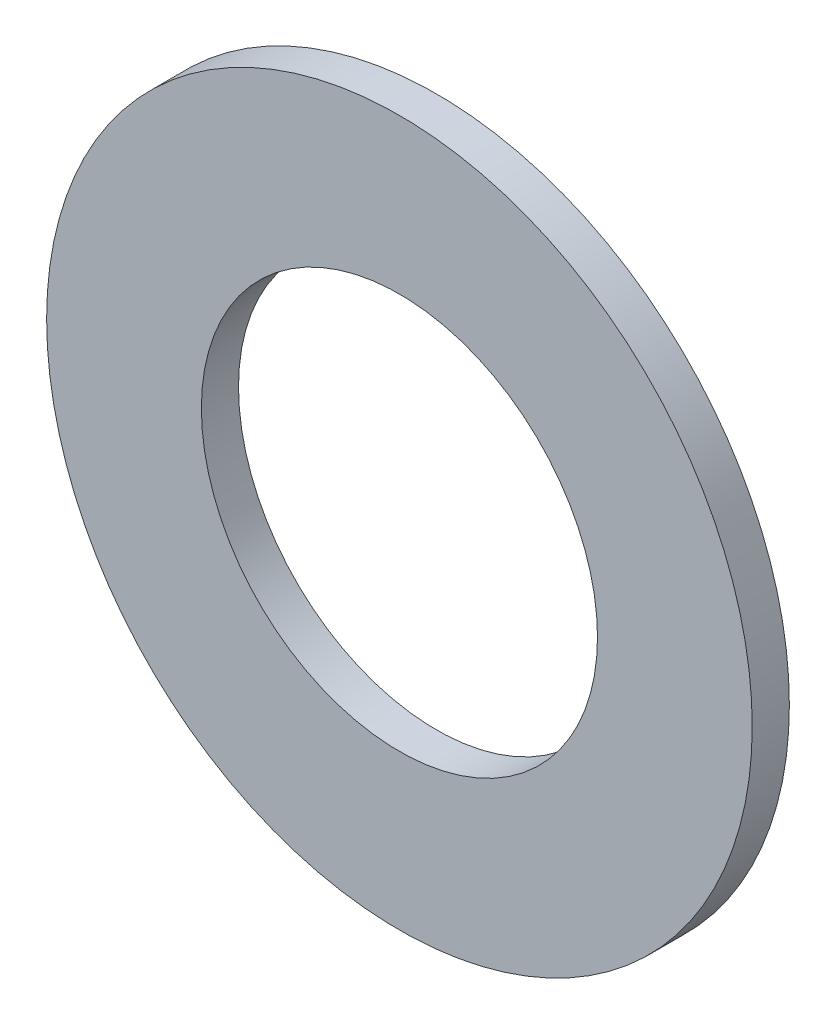
ISO-10303-21;
HEADER;
FILE_DESCRIPTION(('STEP AP214'),'2;1');
FILE_NAME('part.step','',(''),(''),'','','');
FILE_SCHEMA(('AUTOMOTIVE_DESIGN { 1 0 10303 214 1 1 1 1 }'));
ENDSEC;
DATA;
#1=APPLICATION_CONTEXT('core data for automotive mechanical design processes');
#2=APPLICATION_PROTOCOL_DEFINITION('international standard','automotive_design',2000,#1);
#3=PRODUCT_CONTEXT('',#1,'mechanical');
#4=PRODUCT('Part','Part','',(#3));
#5=PRODUCT_RELATED_PRODUCT_CATEGORY('part','',(#4));
#6=PRODUCT_DEFINITION_FORMATION('','',#4);
#7=PRODUCT_DEFINITION_CONTEXT('part definition',#1,'design');
#8=PRODUCT_DEFINITION('design','',#6,#7);
#9=PRODUCT_DEFINITION_SHAPE('','',#8);
#10=(LENGTH_UNIT() NAMED_UNIT(*) SI_UNIT(.MILLI.,.METRE.));
#11=(NAMED_UNIT(*) PLANE_ANGLE_UNIT() SI_UNIT($,.RADIAN.));
#12=(NAMED_UNIT(*) SI_UNIT($,.STERADIAN.) SOLID_ANGLE_UNIT());
#13=UNCERTAINTY_MEASURE_WITH_UNIT(LENGTH_MEASURE(1.E-05),#10,'distance_accuracy_value','');
#14=(GEOMETRIC_REPRESENTATION_CONTEXT(3) GLOBAL_UNCERTAINTY_ASSIGNED_CONTEXT((#13)) GLOBAL_UNIT_ASSIGNED_CONTEXT((#10,
#11,#12)) REPRESENTATION_CONTEXT('',''));
#15=CARTESIAN_POINT('',(0.,0.,0.));
#16=DIRECTION('',(0.,0.,1.));
#17=DIRECTION('',(1.,0.,0.));
#18=AXIS2_PLACEMENT_3D('',#15,#16,#17);
#19=CARTESIAN_POINT('',(0.,0.,0.762));
#20=DIRECTION('',(0.,0.,1.));
#21=DIRECTION('',(1.,0.,0.));
#22=AXIS2_PLACEMENT_3D('',#19,#20,#21);
#23=PLANE('',#22);
#24=CARTESIAN_POINT('',(0.,0.,0.762));
#25=DIRECTION('',(0.,0.,1.));
#26=DIRECTION('',(1.,0.,0.));
#27=AXIS2_PLACEMENT_3D('',#24,#25,#26);
#28=CIRCLE('',#27,7.239);
#29=CARTESIAN_POINT('',(-7.239,0.,0.762));
#30=VERTEX_POINT('',#29);
#31=EDGE_CURVE('E10',#30,#30,#28,.T.);
#32=ORIENTED_EDGE('',*,*,#31,.T.);
#33=EDGE_LOOP('',(#32));
#34=FACE_BOUND('',#33,.T.);
#35=CARTESIAN_POINT('',(0.,0.,0.762));
#36=DIRECTION('',(0.,0.,1.));
#37=DIRECTION('',(1.,0.,0.));
#38=AXIS2_PLACEMENT_3D('',#35,#36,#37);
#39=CIRCLE('',#38,4.064);
#40=CARTESIAN_POINT('',(-4.064,0.,0.762));
#41=VERTEX_POINT('',#40);
#42=EDGE_CURVE('E43',#41,#41,#39,.T.);
#43=ORIENTED_EDGE('',*,*,#42,.F.);
#44=EDGE_LOOP('',(#43));
#45=FACE_BOUND('',#44,.T.);
#46=ADVANCED_FACE('F32',(#34,#45),#23,.T.);
#47=CARTESIAN_POINT('',(0.,0.,0.));
#48=DIRECTION('',(0.,0.,1.));
#49=DIRECTION('',(1.,0.,0.));
#50=AXIS2_PLACEMENT_3D('',#47,#48,#49);
#51=PLANE('',#50);
#52=CARTESIAN_POINT('',(0.,0.,0.));
#53=DIRECTION('',(0.,0.,1.));
#54=DIRECTION('',(1.,0.,0.));
#55=AXIS2_PLACEMENT_3D('',#52,#53,#54);
#56=CIRCLE('',#55,7.239);
#57=CARTESIAN_POINT('',(-7.239,0.,0.));
#58=VERTEX_POINT('',#57);
#59=EDGE_CURVE('E36',#58,#58,#56,.T.);
#60=ORIENTED_EDGE('',*,*,#59,.F.);
#61=EDGE_LOOP('',(#60));
#62=FACE_BOUND('',#61,.T.);
#63=CARTESIAN_POINT('',(0.,0.,0.));
#64=DIRECTION('',(0.,0.,1.));
#65=DIRECTION('',(1.,0.,0.));
#66=AXIS2_PLACEMENT_3D('',#63,#64,#65);
#67=CIRCLE('',#66,4.064);
#68=CARTESIAN_POINT('',(-4.064,0.,0.));
#69=VERTEX_POINT('',#68);
#70=EDGE_CURVE('E45',#69,#69,#67,.T.);
#71=ORIENTED_EDGE('',*,*,#70,.T.);
#72=EDGE_LOOP('',(#71));
#73=FACE_BOUND('',#72,.T.);
#74=ADVANCED_FACE('F55',(#62,#73),#51,.F.);
#75=CARTESIAN_POINT('',(0.,0.,0.762));
#76=DIRECTION('',(0.,0.,-1.));
#77=DIRECTION('',(-1.,0.,0.));
#78=AXIS2_PLACEMENT_3D('',#75,#76,#77);
#79=CYLINDRICAL_SURFACE('',#78,7.239);
#80=CARTESIAN_POINT('',(-7.239,0.,0.762));
#81=CARTESIAN_POINT('',(-7.239,0.,0.7540625));
#82=CARTESIAN_POINT('',(-7.239,0.,0.746125));
#83=CARTESIAN_POINT('',(-7.239,0.,0.73025));
#84=CARTESIAN_POINT('',(-7.239,0.,0.7223125));
#85=CARTESIAN_POINT('',(-7.239,0.,0.7064375));
#86=CARTESIAN_POINT('',(-7.239,0.,0.6985));
#87=CARTESIAN_POINT('',(-7.239,0.,0.682625));
#88=CARTESIAN_POINT('',(-7.239,0.,0.6746875));
#89=CARTESIAN_POINT('',(-7.239,0.,0.6588125));
#90=CARTESIAN_POINT('',(-7.239,0.,0.650875));
#91=CARTESIAN_POINT('',(-7.239,0.,0.635));
#92=CARTESIAN_POINT('',(-7.239,0.,0.6270625));
#93=CARTESIAN_POINT('',(-7.239,0.,0.6111875));
#94=CARTESIAN_POINT('',(-7.239,0.,0.60325));
#95=CARTESIAN_POINT('',(-7.239,0.,0.587375));
#96=CARTESIAN_POINT('',(-7.239,0.,0.5794375));
#97=CARTESIAN_POINT('',(-7.239,0.,0.5635625));
#98=CARTESIAN_POINT('',(-7.239,0.,0.555625));
#99=CARTESIAN_POINT('',(-7.239,0.,0.53975));
#100=CARTESIAN_POINT('',(-7.239,0.,0.5318125));
#101=CARTESIAN_POINT('',(-7.239,0.,0.5159375));
#102=CARTESIAN_POINT('',(-7.239,0.,0.508));
#103=CARTESIAN_POINT('',(-7.239,0.,0.492125));
#104=CARTESIAN_POINT('',(-7.239,0.,0.4841875));
#105=CARTESIAN_POINT('',(-7.239,0.,0.4683125));
#106=CARTESIAN_POINT('',(-7.239,0.,0.460375));
#107=CARTESIAN_POINT('',(-7.239,0.,0.4445));
#108=CARTESIAN_POINT('',(-7.239,0.,0.4365625));
#109=CARTESIAN_POINT('',(-7.239,0.,0.4206875));
#110=CARTESIAN_POINT('',(-7.239,0.,0.41275));
#111=CARTESIAN_POINT('',(-7.239,0.,0.396875));
#112=CARTESIAN_POINT('',(-7.239,0.,0.3889375));
#113=CARTESIAN_POINT('',(-7.239,0.,0.3730625));
#114=CARTESIAN_POINT('',(-7.239,0.,0.365125));
#115=CARTESIAN_POINT('',(-7.239,0.,0.34925));
#116=CARTESIAN_POINT('',(-7.239,0.,0.3413125));
#117=CARTESIAN_POINT('',(-7.239,0.,0.3254375));
#118=CARTESIAN_POINT('',(-7.239,0.,0.3175));
#119=CARTESIAN_POINT('',(-7.239,0.,0.301625));
#120=CARTESIAN_POINT('',(-7.239,0.,0.2936875));
#121=CARTESIAN_POINT('',(-7.239,0.,0.2778125));
#122=CARTESIAN_POINT('',(-7.239,0.,0.269875));
#123=CARTESIAN_POINT('',(-7.239,0.,0.254));
#124=CARTESIAN_POINT('',(-7.239,0.,0.2460625));
#125=CARTESIAN_POINT('',(-7.239,0.,0.2301875));
#126=CARTESIAN_POINT('',(-7.239,0.,0.22225));
#127=CARTESIAN_POINT('',(-7.239,0.,0.206375));
#128=CARTESIAN_POINT('',(-7.239,0.,0.1984375));
#129=CARTESIAN_POINT('',(-7.239,0.,0.1825625));
#130=CARTESIAN_POINT('',(-7.239,0.,0.174625));
#131=CARTESIAN_POINT('',(-7.239,0.,0.15875));
#132=CARTESIAN_POINT('',(-7.239,0.,0.1508125));
#133=CARTESIAN_POINT('',(-7.239,0.,0.1349375));
#134=CARTESIAN_POINT('',(-7.239,0.,0.127));
#135=CARTESIAN_POINT('',(-7.239,0.,0.111125));
#136=CARTESIAN_POINT('',(-7.239,0.,0.1031875));
#137=CARTESIAN_POINT('',(-7.239,0.,0.0873125));
#138=CARTESIAN_POINT('',(-7.239,0.,0.079375));
#139=CARTESIAN_POINT('',(-7.239,0.,0.0635));
#140=CARTESIAN_POINT('',(-7.239,0.,0.0555625));
#141=CARTESIAN_POINT('',(-7.239,0.,0.0396875));
#142=CARTESIAN_POINT('',(-7.239,0.,0.03175));
#143=CARTESIAN_POINT('',(-7.239,0.,0.015875));
#144=CARTESIAN_POINT('',(-7.239,0.,0.00793749999999999));
#145=CARTESIAN_POINT('',(-7.239,0.,0.));
#146=B_SPLINE_CURVE_WITH_KNOTS('',3,(#80,#81,#82,#83,#84,#85,#86,#87,#88,#89,#90,#91,#92,#93,
#94,#95,#96,#97,#98,#99,#100,#101,#102,#103,#104,#105,#106,#107,#108,#109,#110,#111,#112,#113,
#114,#115,#116,#117,#118,#119,#120,#121,#122,#123,#124,#125,#126,#127,#128,#129,#130,#131,#132,
#133,#134,#135,#136,#137,#138,#139,#140,#141,#142,#143,#144,#145),.UNSPECIFIED.,.F.,.F.,(4,2,2,
2,2,2,2,2,2,2,2,2,2,2,2,2,2,2,2,2,2,2,2,2,2,2,2,2,2,2,2,2,4),(0.,0.0238125000000001,0.047625,
0.0714375,0.0952500000000001,0.1190625,0.142875,0.1666875,0.1905,0.2143125,0.238125,0.2619375,
0.28575,0.3095625,0.333375,0.3571875,0.381,0.4048125,0.428625,0.4524375,0.47625,0.5000625,
0.523875,0.5476875,0.5715,0.5953125,0.619125,0.6429375,0.66675,0.6905625,0.714375,0.7381875,
0.762),.UNSPECIFIED.);
#147=EDGE_CURVE('BSEAM34',#30,#58,#146,.T.);
#148=ORIENTED_EDGE('',*,*,#31,.F.);
#149=ORIENTED_EDGE('',*,*,#59,.T.);
#150=ORIENTED_EDGE('',*,*,#147,.T.);
#151=ORIENTED_EDGE('',*,*,#147,.F.);
#152=EDGE_LOOP('',(#148,#150,#149,#151));
#153=FACE_BOUND('',#152,.T.);
#154=ADVANCED_FACE('F34',(#153),#79,.T.);
#155=CARTESIAN_POINT('',(0.,0.,0.762));
#156=DIRECTION('',(0.,0.,-1.));
#157=DIRECTION('',(-1.,0.,0.));
#158=AXIS2_PLACEMENT_3D('',#155,#156,#157);
#159=CYLINDRICAL_SURFACE('',#158,4.064);
#160=CARTESIAN_POINT('',(-4.064,0.,0.762));
#161=CARTESIAN_POINT('',(-4.064,0.,0.7540625));
#162=CARTESIAN_POINT('',(-4.064,0.,0.746125));
#163=CARTESIAN_POINT('',(-4.064,0.,0.73025));
#164=CARTESIAN_POINT('',(-4.064,0.,0.7223125));
#165=CARTESIAN_POINT('',(-4.064,0.,0.7064375));
#166=CARTESIAN_POINT('',(-4.064,0.,0.6985));
#167=CARTESIAN_POINT('',(-4.064,0.,0.682625));
#168=CARTESIAN_POINT('',(-4.064,0.,0.6746875));
#169=CARTESIAN_POINT('',(-4.064,0.,0.6588125));
#170=CARTESIAN_POINT('',(-4.064,0.,0.650875));
#171=CARTESIAN_POINT('',(-4.064,0.,0.635));
#172=CARTESIAN_POINT('',(-4.064,0.,0.6270625));
#173=CARTESIAN_POINT('',(-4.064,0.,0.6111875));
#174=CARTESIAN_POINT('',(-4.064,0.,0.60325));
#175=CARTESIAN_POINT('',(-4.064,0.,0.587375));
#176=CARTESIAN_POINT('',(-4.064,0.,0.5794375));
#177=CARTESIAN_POINT('',(-4.064,0.,0.5635625));
#178=CARTESIAN_POINT('',(-4.064,0.,0.555625));
#179=CARTESIAN_POINT('',(-4.064,0.,0.53975));
#180=CARTESIAN_POINT('',(-4.064,0.,0.5318125));
#181=CARTESIAN_POINT('',(-4.064,0.,0.5159375));
#182=CARTESIAN_POINT('',(-4.064,0.,0.508));
#183=CARTESIAN_POINT('',(-4.064,0.,0.492125));
#184=CARTESIAN_POINT('',(-4.064,0.,0.4841875));
#185=CARTESIAN_POINT('',(-4.064,0.,0.4683125));
#186=CARTESIAN_POINT('',(-4.064,0.,0.460375));
#187=CARTESIAN_POINT('',(-4.064,0.,0.4445));
#188=CARTESIAN_POINT('',(-4.064,0.,0.4365625));
#189=CARTESIAN_POINT('',(-4.064,0.,0.4206875));
#190=CARTESIAN_POINT('',(-4.064,0.,0.41275));
#191=CARTESIAN_POINT('',(-4.064,0.,0.396875));
#192=CARTESIAN_POINT('',(-4.064,0.,0.3889375));
#193=CARTESIAN_POINT('',(-4.064,0.,0.3730625));
#194=CARTESIAN_POINT('',(-4.064,0.,0.365125));
#195=CARTESIAN_POINT('',(-4.064,0.,0.34925));
#196=CARTESIAN_POINT('',(-4.064,0.,0.3413125));
#197=CARTESIAN_POINT('',(-4.064,0.,0.3254375));
#198=CARTESIAN_POINT('',(-4.064,0.,0.3175));
#199=CARTESIAN_POINT('',(-4.064,0.,0.301625));
#200=CARTESIAN_POINT('',(-4.064,0.,0.2936875));
#201=CARTESIAN_POINT('',(-4.064,0.,0.2778125));
#202=CARTESIAN_POINT('',(-4.064,0.,0.269875));
#203=CARTESIAN_POINT('',(-4.064,0.,0.254));
#204=CARTESIAN_POINT('',(-4.064,0.,0.2460625));
#205=CARTESIAN_POINT('',(-4.064,0.,0.2301875));
#206=CARTESIAN_POINT('',(-4.064,0.,0.22225));
#207=CARTESIAN_POINT('',(-4.064,0.,0.206375));
#208=CARTESIAN_POINT('',(-4.064,0.,0.1984375));
#209=CARTESIAN_POINT('',(-4.064,0.,0.1825625));
#210=CARTESIAN_POINT('',(-4.064,0.,0.174625));
#211=CARTESIAN_POINT('',(-4.064,0.,0.15875));
#212=CARTESIAN_POINT('',(-4.064,0.,0.1508125));
#213=CARTESIAN_POINT('',(-4.064,0.,0.1349375));
#214=CARTESIAN_POINT('',(-4.064,0.,0.127));
#215=CARTESIAN_POINT('',(-4.064,0.,0.111125));
#216=CARTESIAN_POINT('',(-4.064,0.,0.1031875));
#217=CARTESIAN_POINT('',(-4.064,0.,0.0873125));
#218=CARTESIAN_POINT('',(-4.064,0.,0.079375));
#219=CARTESIAN_POINT('',(-4.064,0.,0.0635));
#220=CARTESIAN_POINT('',(-4.064,0.,0.0555625));
#221=CARTESIAN_POINT('',(-4.064,0.,0.0396875));
#222=CARTESIAN_POINT('',(-4.064,0.,0.03175));
#223=CARTESIAN_POINT('',(-4.064,0.,0.015875));
#224=CARTESIAN_POINT('',(-4.064,0.,0.00793749999999999));
#225=CARTESIAN_POINT('',(-4.064,0.,0.));
#226=B_SPLINE_CURVE_WITH_KNOTS('',3,(#160,#161,#162,#163,#164,#165,#166,#167,#168,#169,#170,
#171,#172,#173,#174,#175,#176,#177,#178,#179,#180,#181,#182,#183,#184,#185,#186,#187,#188,#189,
#190,#191,#192,#193,#194,#195,#196,#197,#198,#199,#200,#201,#202,#203,#204,#205,#206,#207,#208,
#209,#210,#211,#212,#213,#214,#215,#216,#217,#218,#219,#220,#221,#222,#223,#224,#225),
.UNSPECIFIED.,.F.,.F.,(4,2,2,2,2,2,2,2,2,2,2,2,2,2,2,2,2,2,2,2,2,2,2,2,2,2,2,2,2,2,2,2,4),(0.,
0.0238125,0.0476249999999999,0.0714374999999999,0.09525,0.1190625,0.142875,0.1666875,0.1905,
0.2143125,0.238125,0.2619375,0.28575,0.3095625,0.333375,0.3571875,0.381,0.4048125,0.428625,
0.4524375,0.47625,0.5000625,0.523875,0.5476875,0.5715,0.5953125,0.619125,0.6429375,0.66675,
0.6905625,0.714375,0.7381875,0.762),.UNSPECIFIED.);
#227=EDGE_CURVE('BSEAM51',#41,#69,#226,.T.);
#228=ORIENTED_EDGE('',*,*,#42,.T.);
#229=ORIENTED_EDGE('',*,*,#70,.F.);
#230=ORIENTED_EDGE('',*,*,#227,.T.);
#231=ORIENTED_EDGE('',*,*,#227,.F.);
#232=EDGE_LOOP('',(#228,#230,#229,#231));
#233=FACE_BOUND('',#232,.T.);
#234=ADVANCED_FACE('F51',(#233),#159,.F.);
#235=CLOSED_SHELL('',(#46,#74,#154,#234));
#236=MANIFOLD_SOLID_BREP('B2',#235);
#237=ADVANCED_BREP_SHAPE_REPRESENTATION('',(#18,#236),#14);
#238=SHAPE_DEFINITION_REPRESENTATION(#9,#237);
ENDSEC;
END-ISO-10303-21;
